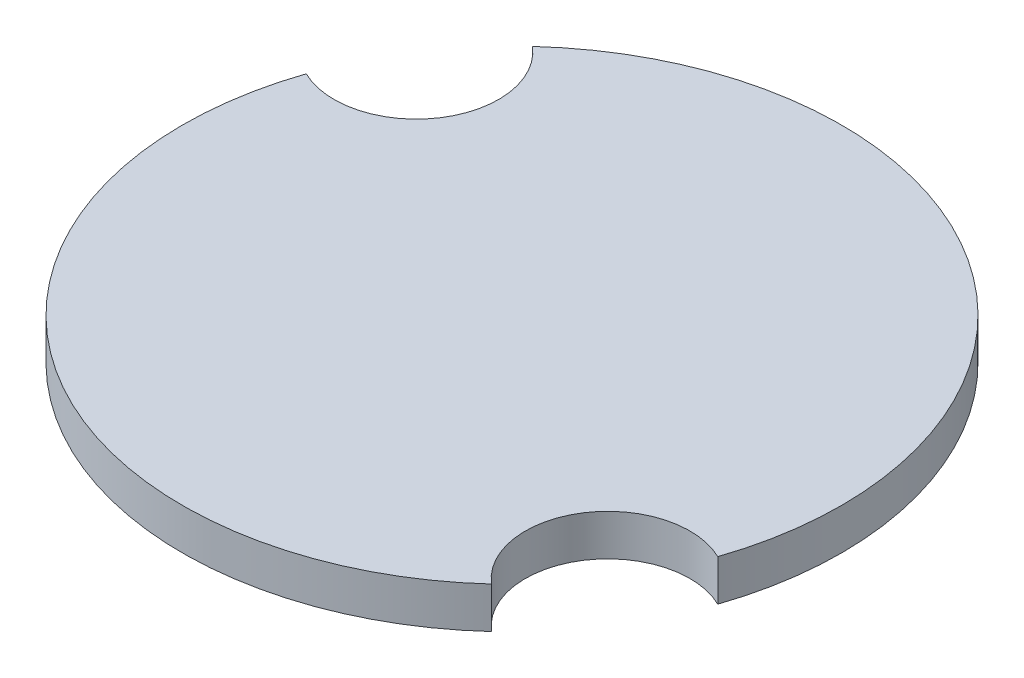
ISO-10303-21;
HEADER;
FILE_DESCRIPTION(('STEP AP214'),'2;1');
FILE_NAME('part.step','',(''),(''),'','','');
FILE_SCHEMA(('AUTOMOTIVE_DESIGN { 1 0 10303 214 1 1 1 1 }'));
ENDSEC;
DATA;
#1=APPLICATION_CONTEXT('core data for automotive mechanical design processes');
#2=APPLICATION_PROTOCOL_DEFINITION('international standard','automotive_design',2000,#1);
#3=PRODUCT_CONTEXT('',#1,'mechanical');
#4=PRODUCT('Part','Part','',(#3));
#5=PRODUCT_RELATED_PRODUCT_CATEGORY('part','',(#4));
#6=PRODUCT_DEFINITION_FORMATION('','',#4);
#7=PRODUCT_DEFINITION_CONTEXT('part definition',#1,'design');
#8=PRODUCT_DEFINITION('design','',#6,#7);
#9=PRODUCT_DEFINITION_SHAPE('','',#8);
#10=(LENGTH_UNIT() NAMED_UNIT(*) SI_UNIT(.MILLI.,.METRE.));
#11=(NAMED_UNIT(*) PLANE_ANGLE_UNIT() SI_UNIT($,.RADIAN.));
#12=(NAMED_UNIT(*) SI_UNIT($,.STERADIAN.) SOLID_ANGLE_UNIT());
#13=UNCERTAINTY_MEASURE_WITH_UNIT(LENGTH_MEASURE(1.E-05),#10,'distance_accuracy_value','');
#14=(GEOMETRIC_REPRESENTATION_CONTEXT(3) GLOBAL_UNCERTAINTY_ASSIGNED_CONTEXT((#13)) GLOBAL_UNIT_ASSIGNED_CONTEXT((#10,
#11,#12)) REPRESENTATION_CONTEXT('',''));
#15=CARTESIAN_POINT('',(0.,0.,0.));
#16=DIRECTION('',(0.,0.,1.));
#17=DIRECTION('',(1.,0.,0.));
#18=AXIS2_PLACEMENT_3D('',#15,#16,#17);
#19=CARTESIAN_POINT('',(27.5149364322829,5.,26.4159408215505));
#20=DIRECTION('',(0.,-1.,0.));
#21=DIRECTION('',(0.,0.,-1.));
#22=AXIS2_PLACEMENT_3D('',#19,#20,#21);
#23=CYLINDRICAL_SURFACE('',#22,40.);
#24=CARTESIAN_POINT('',(27.5149364322829,0.,26.4159408215505));
#25=DIRECTION('',(0.,1.,0.));
#26=DIRECTION('',(0.,0.,1.));
#27=AXIS2_PLACEMENT_3D('',#24,#25,#26);
#28=CIRCLE('',#27,40.);
#29=CARTESIAN_POINT('',(-10.3519095047667,0.,13.5278851582726));
#30=VERTEX_POINT('',#29);
#31=CARTESIAN_POINT('',(54.528696080903,0.,55.9160559000817));
#32=VERTEX_POINT('',#31);
#33=EDGE_CURVE('E92',#30,#32,#28,.T.);
#34=ORIENTED_EDGE('',*,*,#33,.T.);
#35=DIRECTION('',(0.,-1.,0.));
#36=VECTOR('',#35,1.);
#37=CARTESIAN_POINT('',(54.528696080903,-3.,55.9160559000817));
#38=LINE('',#37,#36);
#39=CARTESIAN_POINT('',(54.528696080903,5.,55.9160559000817));
#40=VERTEX_POINT('',#39);
#41=EDGE_CURVE('E52',#32,#40,#38,.F.);
#42=ORIENTED_EDGE('',*,*,#41,.T.);
#43=CARTESIAN_POINT('',(27.5149364322829,5.,26.4159408215505));
#44=DIRECTION('',(0.,1.,0.));
#45=DIRECTION('',(0.,0.,1.));
#46=AXIS2_PLACEMENT_3D('',#43,#44,#45);
#47=CIRCLE('',#46,40.);
#48=CARTESIAN_POINT('',(-10.3519095047667,5.,13.5278851582726));
#49=VERTEX_POINT('',#48);
#50=EDGE_CURVE('E89',#49,#40,#47,.T.);
#51=ORIENTED_EDGE('',*,*,#50,.F.);
#52=DIRECTION('',(0.,-1.,0.));
#53=VECTOR('',#52,1.);
#54=CARTESIAN_POINT('',(-10.3519095047667,-3.,13.5278851582726));
#55=LINE('',#54,#53);
#56=EDGE_CURVE('E105',#49,#30,#55,.T.);
#57=ORIENTED_EDGE('',*,*,#56,.T.);
#58=EDGE_LOOP('',(#34,#42,#51,#57));
#59=FACE_BOUND('',#58,.T.);
#60=ADVANCED_FACE('F37',(#59),#23,.T.);
#61=CARTESIAN_POINT('',(65.3817823693325,5.,39.3039964848284));
#62=VERTEX_POINT('',#61);
#63=CARTESIAN_POINT('',(0.501176783662734,5.,-3.08417425698066));
#64=VERTEX_POINT('',#63);
#65=EDGE_CURVE('E86',#62,#64,#47,.T.);
#66=ORIENTED_EDGE('',*,*,#65,.F.);
#67=DIRECTION('',(0.,-1.,0.));
#68=VECTOR('',#67,1.);
#69=CARTESIAN_POINT('',(65.3817823693325,-3.,39.3039964848284));
#70=LINE('',#69,#68);
#71=CARTESIAN_POINT('',(65.3817823693325,0.,39.3039964848284));
#72=VERTEX_POINT('',#71);
#73=EDGE_CURVE('E76',#62,#72,#70,.T.);
#74=ORIENTED_EDGE('',*,*,#73,.T.);
#75=CARTESIAN_POINT('',(0.501176783662734,0.,-3.08417425698066));
#76=VERTEX_POINT('',#75);
#77=EDGE_CURVE('E59',#72,#76,#28,.T.);
#78=ORIENTED_EDGE('',*,*,#77,.T.);
#79=DIRECTION('',(0.,-1.,0.));
#80=VECTOR('',#79,1.);
#81=CARTESIAN_POINT('',(0.501176783662734,-3.,-3.08417425698066));
#82=LINE('',#81,#80);
#83=EDGE_CURVE('E91',#76,#64,#82,.F.);
#84=ORIENTED_EDGE('',*,*,#83,.T.);
#85=EDGE_LOOP('',(#66,#74,#78,#84));
#86=FACE_BOUND('',#85,.T.);
#87=ADVANCED_FACE('F39',(#86),#23,.T.);
#88=CARTESIAN_POINT('',(27.5149364322829,5.,26.4159408215505));
#89=DIRECTION('',(0.,1.,0.));
#90=DIRECTION('',(0.,0.,1.));
#91=AXIS2_PLACEMENT_3D('',#88,#89,#90);
#92=PLANE('',#91);
#93=CARTESIAN_POINT('',(61.0017006055318,5.,48.2937063657101));
#94=DIRECTION('',(0.,-1.,0.));
#95=DIRECTION('',(0.,0.,-1.));
#96=AXIS2_PLACEMENT_3D('',#93,#94,#95);
#97=CIRCLE('',#96,10.);
#98=EDGE_CURVE('E79',#40,#62,#97,.T.);
#99=ORIENTED_EDGE('',*,*,#98,.T.);
#100=ORIENTED_EDGE('',*,*,#65,.T.);
#101=CARTESIAN_POINT('',(-5.97182774096603,5.,4.53817527739097));
#102=DIRECTION('',(0.,-1.,0.));
#103=DIRECTION('',(0.,0.,-1.));
#104=AXIS2_PLACEMENT_3D('',#101,#102,#103);
#105=CIRCLE('',#104,10.);
#106=EDGE_CURVE('E107',#64,#49,#105,.T.);
#107=ORIENTED_EDGE('',*,*,#106,.T.);
#108=ORIENTED_EDGE('',*,*,#50,.T.);
#109=EDGE_LOOP('',(#99,#100,#107,#108));
#110=FACE_BOUND('',#109,.T.);
#111=ADVANCED_FACE('F84',(#110),#92,.T.);
#112=CARTESIAN_POINT('',(27.5149364322829,0.,26.4159408215505));
#113=DIRECTION('',(0.,1.,0.));
#114=DIRECTION('',(0.,0.,1.));
#115=AXIS2_PLACEMENT_3D('',#112,#113,#114);
#116=PLANE('',#115);
#117=ORIENTED_EDGE('',*,*,#77,.F.);
#118=CARTESIAN_POINT('',(61.0017006055318,0.,48.2937063657101));
#119=DIRECTION('',(0.,1.,0.));
#120=DIRECTION('',(0.,0.,1.));
#121=AXIS2_PLACEMENT_3D('',#118,#119,#120);
#122=CIRCLE('',#121,10.);
#123=EDGE_CURVE('E12',#72,#32,#122,.T.);
#124=ORIENTED_EDGE('',*,*,#123,.T.);
#125=ORIENTED_EDGE('',*,*,#33,.F.);
#126=CARTESIAN_POINT('',(-5.97182774096603,0.,4.53817527739097));
#127=DIRECTION('',(0.,1.,0.));
#128=DIRECTION('',(0.,0.,1.));
#129=AXIS2_PLACEMENT_3D('',#126,#127,#128);
#130=CIRCLE('',#129,10.);
#131=EDGE_CURVE('E45',#30,#76,#130,.T.);
#132=ORIENTED_EDGE('',*,*,#131,.T.);
#133=EDGE_LOOP('',(#117,#124,#125,#132));
#134=FACE_BOUND('',#133,.T.);
#135=ADVANCED_FACE('F101',(#134),#116,.F.);
#136=CARTESIAN_POINT('',(-5.97182774096603,5.,4.53817527739097));
#137=DIRECTION('',(0.,-1.,0.));
#138=DIRECTION('',(0.,0.,-1.));
#139=AXIS2_PLACEMENT_3D('',#136,#137,#138);
#140=CYLINDRICAL_SURFACE('',#139,10.);
#141=ORIENTED_EDGE('',*,*,#131,.F.);
#142=ORIENTED_EDGE('',*,*,#56,.F.);
#143=ORIENTED_EDGE('',*,*,#106,.F.);
#144=ORIENTED_EDGE('',*,*,#83,.F.);
#145=EDGE_LOOP('',(#141,#142,#143,#144));
#146=FACE_BOUND('',#145,.T.);
#147=ADVANCED_FACE('F104',(#146),#140,.F.);
#148=CARTESIAN_POINT('',(61.0017006055318,5.,48.2937063657101));
#149=DIRECTION('',(0.,-1.,0.));
#150=DIRECTION('',(0.,0.,-1.));
#151=AXIS2_PLACEMENT_3D('',#148,#149,#150);
#152=CYLINDRICAL_SURFACE('',#151,10.);
#153=ORIENTED_EDGE('',*,*,#123,.F.);
#154=ORIENTED_EDGE('',*,*,#73,.F.);
#155=ORIENTED_EDGE('',*,*,#98,.F.);
#156=ORIENTED_EDGE('',*,*,#41,.F.);
#157=EDGE_LOOP('',(#153,#154,#155,#156));
#158=FACE_BOUND('',#157,.T.);
#159=ADVANCED_FACE('F78',(#158),#152,.F.);
#160=CLOSED_SHELL('',(#60,#87,#111,#135,#147,#159));
#161=MANIFOLD_SOLID_BREP('B2',#160);
#162=ADVANCED_BREP_SHAPE_REPRESENTATION('',(#18,#161),#14);
#163=SHAPE_DEFINITION_REPRESENTATION(#9,#162);
ENDSEC;
END-ISO-10303-21;
